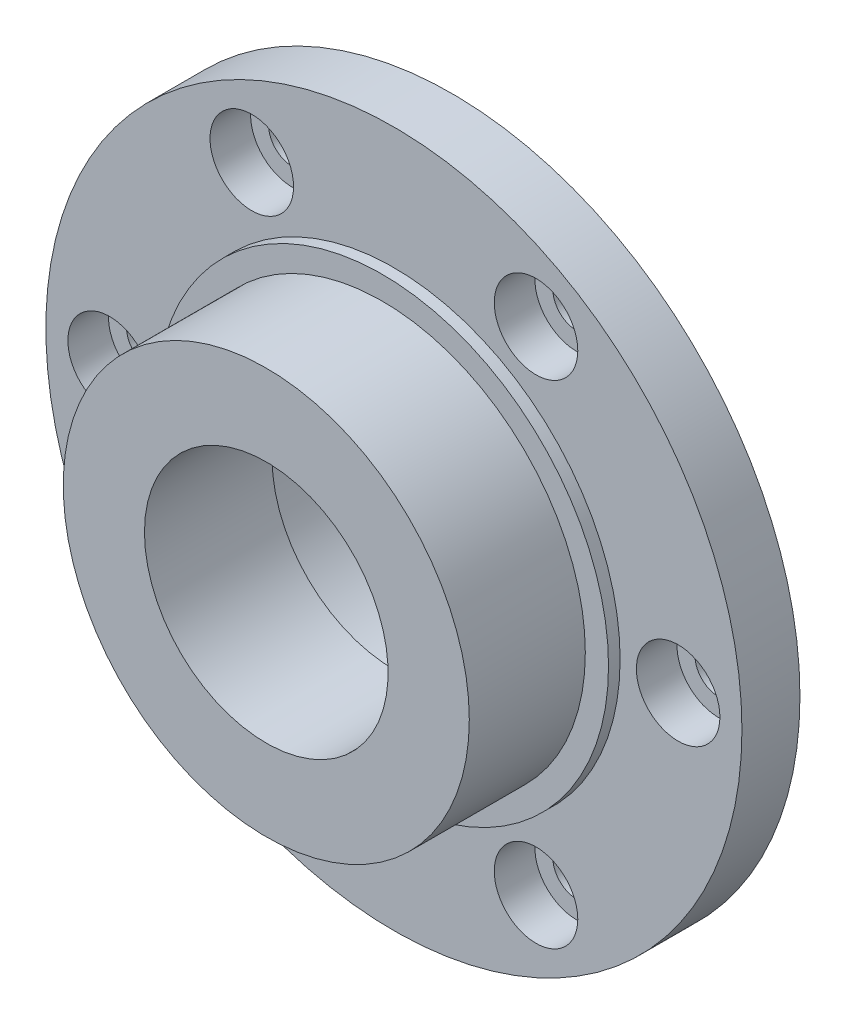
ISO-10303-21;
HEADER;
FILE_DESCRIPTION(('STEP AP214'),'2;1');
FILE_NAME('part.step','',(''),(''),'','','');
FILE_SCHEMA(('AUTOMOTIVE_DESIGN { 1 0 10303 214 1 1 1 1 }'));
ENDSEC;
DATA;
#1=APPLICATION_CONTEXT('core data for automotive mechanical design processes');
#2=APPLICATION_PROTOCOL_DEFINITION('international standard','automotive_design',2000,#1);
#3=PRODUCT_CONTEXT('',#1,'mechanical');
#4=PRODUCT('Part','Part','',(#3));
#5=PRODUCT_RELATED_PRODUCT_CATEGORY('part','',(#4));
#6=PRODUCT_DEFINITION_FORMATION('','',#4);
#7=PRODUCT_DEFINITION_CONTEXT('part definition',#1,'design');
#8=PRODUCT_DEFINITION('design','',#6,#7);
#9=PRODUCT_DEFINITION_SHAPE('','',#8);
#10=(LENGTH_UNIT() NAMED_UNIT(*) SI_UNIT(.MILLI.,.METRE.));
#11=(NAMED_UNIT(*) PLANE_ANGLE_UNIT() SI_UNIT($,.RADIAN.));
#12=(NAMED_UNIT(*) SI_UNIT($,.STERADIAN.) SOLID_ANGLE_UNIT());
#13=UNCERTAINTY_MEASURE_WITH_UNIT(LENGTH_MEASURE(1.E-05),#10,'distance_accuracy_value','');
#14=(GEOMETRIC_REPRESENTATION_CONTEXT(3) GLOBAL_UNCERTAINTY_ASSIGNED_CONTEXT((#13)) GLOBAL_UNIT_ASSIGNED_CONTEXT((#10,
#11,#12)) REPRESENTATION_CONTEXT('',''));
#15=CARTESIAN_POINT('',(0.,0.,0.));
#16=DIRECTION('',(0.,0.,1.));
#17=DIRECTION('',(1.,0.,0.));
#18=AXIS2_PLACEMENT_3D('',#15,#16,#17);
#19=CARTESIAN_POINT('',(12.25,-21.2176223927188,0.));
#20=DIRECTION('',(0.,0.,1.));
#21=DIRECTION('',(1.,0.,0.));
#22=AXIS2_PLACEMENT_3D('',#19,#20,#21);
#23=CYLINDRICAL_SURFACE('',#22,2.05);
#24=CARTESIAN_POINT('',(12.25,-21.2176223927188,0.));
#25=DIRECTION('',(0.,0.,1.));
#26=DIRECTION('',(1.,0.,0.));
#27=AXIS2_PLACEMENT_3D('',#24,#25,#26);
#28=CIRCLE('',#27,2.05);
#29=CARTESIAN_POINT('',(14.3,-21.2176223927188,0.));
#30=VERTEX_POINT('',#29);
#31=EDGE_CURVE('E108',#30,#30,#28,.T.);
#32=ORIENTED_EDGE('',*,*,#31,.F.);
#33=EDGE_LOOP('',(#32));
#34=FACE_BOUND('',#33,.T.);
#35=CARTESIAN_POINT('',(12.25,-21.2176223927188,1.5));
#36=DIRECTION('',(0.,0.,1.));
#37=DIRECTION('',(1.,0.,0.));
#38=AXIS2_PLACEMENT_3D('',#35,#36,#37);
#39=CIRCLE('',#38,2.05);
#40=CARTESIAN_POINT('',(14.3,-21.2176223927188,1.5));
#41=VERTEX_POINT('',#40);
#42=EDGE_CURVE('E41',#41,#41,#39,.F.);
#43=ORIENTED_EDGE('',*,*,#42,.F.);
#44=EDGE_LOOP('',(#43));
#45=FACE_BOUND('',#44,.T.);
#46=ADVANCED_FACE('F37',(#34,#45),#23,.F.);
#47=CARTESIAN_POINT('',(-12.2500000000001,-21.2176223927187,0.));
#48=DIRECTION('',(0.,0.,1.));
#49=DIRECTION('',(1.,0.,0.));
#50=AXIS2_PLACEMENT_3D('',#47,#48,#49);
#51=CYLINDRICAL_SURFACE('',#50,2.05);
#52=CARTESIAN_POINT('',(-12.2500000000001,-21.2176223927187,0.));
#53=DIRECTION('',(0.,0.,1.));
#54=DIRECTION('',(1.,0.,0.));
#55=AXIS2_PLACEMENT_3D('',#52,#53,#54);
#56=CIRCLE('',#55,2.05);
#57=CARTESIAN_POINT('',(-10.2000000000001,-21.2176223927187,0.));
#58=VERTEX_POINT('',#57);
#59=EDGE_CURVE('E112',#58,#58,#56,.T.);
#60=ORIENTED_EDGE('',*,*,#59,.F.);
#61=EDGE_LOOP('',(#60));
#62=FACE_BOUND('',#61,.T.);
#63=CARTESIAN_POINT('',(-12.2500000000001,-21.2176223927187,1.5));
#64=DIRECTION('',(0.,0.,1.));
#65=DIRECTION('',(1.,0.,0.));
#66=AXIS2_PLACEMENT_3D('',#63,#64,#65);
#67=CIRCLE('',#66,2.05);
#68=CARTESIAN_POINT('',(-10.2000000000001,-21.2176223927187,1.5));
#69=VERTEX_POINT('',#68);
#70=EDGE_CURVE('E85',#69,#69,#67,.F.);
#71=ORIENTED_EDGE('',*,*,#70,.F.);
#72=EDGE_LOOP('',(#71));
#73=FACE_BOUND('',#72,.T.);
#74=ADVANCED_FACE('F127',(#62,#73),#51,.F.);
#75=CARTESIAN_POINT('',(-24.5,1.71082585603314E-13,0.));
#76=DIRECTION('',(0.,0.,1.));
#77=DIRECTION('',(1.,0.,0.));
#78=AXIS2_PLACEMENT_3D('',#75,#76,#77);
#79=CYLINDRICAL_SURFACE('',#78,2.05);
#80=CARTESIAN_POINT('',(-24.5,1.71082585603314E-13,0.));
#81=DIRECTION('',(0.,0.,1.));
#82=DIRECTION('',(1.,0.,0.));
#83=AXIS2_PLACEMENT_3D('',#80,#81,#82);
#84=CIRCLE('',#83,2.05);
#85=CARTESIAN_POINT('',(-22.45,1.71082585603314E-13,0.));
#86=VERTEX_POINT('',#85);
#87=EDGE_CURVE('E103',#86,#86,#84,.T.);
#88=ORIENTED_EDGE('',*,*,#87,.F.);
#89=EDGE_LOOP('',(#88));
#90=FACE_BOUND('',#89,.T.);
#91=CARTESIAN_POINT('',(-24.5,1.71082585603314E-13,1.5));
#92=DIRECTION('',(0.,0.,1.));
#93=DIRECTION('',(1.,0.,0.));
#94=AXIS2_PLACEMENT_3D('',#91,#92,#93);
#95=CIRCLE('',#94,2.05);
#96=CARTESIAN_POINT('',(-22.45,1.71082585603314E-13,1.5));
#97=VERTEX_POINT('',#96);
#98=EDGE_CURVE('E82',#97,#97,#95,.F.);
#99=ORIENTED_EDGE('',*,*,#98,.F.);
#100=EDGE_LOOP('',(#99));
#101=FACE_BOUND('',#100,.T.);
#102=ADVANCED_FACE('F123',(#90,#101),#79,.F.);
#103=CARTESIAN_POINT('',(-12.2499999999998,21.2176223927189,0.));
#104=DIRECTION('',(0.,0.,1.));
#105=DIRECTION('',(1.,0.,0.));
#106=AXIS2_PLACEMENT_3D('',#103,#104,#105);
#107=CYLINDRICAL_SURFACE('',#106,2.05);
#108=CARTESIAN_POINT('',(-12.2499999999998,21.2176223927189,0.));
#109=DIRECTION('',(0.,0.,1.));
#110=DIRECTION('',(1.,0.,0.));
#111=AXIS2_PLACEMENT_3D('',#108,#109,#110);
#112=CIRCLE('',#111,2.05);
#113=CARTESIAN_POINT('',(-10.1999999999998,21.2176223927189,0.));
#114=VERTEX_POINT('',#113);
#115=EDGE_CURVE('E97',#114,#114,#112,.T.);
#116=ORIENTED_EDGE('',*,*,#115,.F.);
#117=EDGE_LOOP('',(#116));
#118=FACE_BOUND('',#117,.T.);
#119=CARTESIAN_POINT('',(-12.2499999999998,21.2176223927189,1.5));
#120=DIRECTION('',(0.,0.,1.));
#121=DIRECTION('',(1.,0.,0.));
#122=AXIS2_PLACEMENT_3D('',#119,#120,#121);
#123=CIRCLE('',#122,2.05);
#124=CARTESIAN_POINT('',(-10.1999999999998,21.2176223927189,1.5));
#125=VERTEX_POINT('',#124);
#126=EDGE_CURVE('E78',#125,#125,#123,.F.);
#127=ORIENTED_EDGE('',*,*,#126,.F.);
#128=EDGE_LOOP('',(#127));
#129=FACE_BOUND('',#128,.T.);
#130=ADVANCED_FACE('F126',(#118,#129),#107,.F.);
#131=CARTESIAN_POINT('',(12.2500000000002,21.2176223927186,0.));
#132=DIRECTION('',(0.,0.,1.));
#133=DIRECTION('',(1.,0.,0.));
#134=AXIS2_PLACEMENT_3D('',#131,#132,#133);
#135=CYLINDRICAL_SURFACE('',#134,2.05);
#136=CARTESIAN_POINT('',(12.2500000000002,21.2176223927186,0.));
#137=DIRECTION('',(0.,0.,1.));
#138=DIRECTION('',(1.,0.,0.));
#139=AXIS2_PLACEMENT_3D('',#136,#137,#138);
#140=CIRCLE('',#139,2.05);
#141=CARTESIAN_POINT('',(14.3000000000002,21.2176223927186,0.));
#142=VERTEX_POINT('',#141);
#143=EDGE_CURVE('E92',#142,#142,#140,.T.);
#144=ORIENTED_EDGE('',*,*,#143,.F.);
#145=EDGE_LOOP('',(#144));
#146=FACE_BOUND('',#145,.T.);
#147=CARTESIAN_POINT('',(12.2500000000002,21.2176223927186,1.5));
#148=DIRECTION('',(0.,0.,1.));
#149=DIRECTION('',(1.,0.,0.));
#150=AXIS2_PLACEMENT_3D('',#147,#148,#149);
#151=CIRCLE('',#150,2.05);
#152=CARTESIAN_POINT('',(14.3000000000002,21.2176223927186,1.5));
#153=VERTEX_POINT('',#152);
#154=EDGE_CURVE('E73',#153,#153,#151,.F.);
#155=ORIENTED_EDGE('',*,*,#154,.F.);
#156=EDGE_LOOP('',(#155));
#157=FACE_BOUND('',#156,.T.);
#158=ADVANCED_FACE('F160',(#146,#157),#135,.F.);
#159=CARTESIAN_POINT('',(24.5,0.,0.));
#160=DIRECTION('',(0.,0.,1.));
#161=DIRECTION('',(1.,0.,0.));
#162=AXIS2_PLACEMENT_3D('',#159,#160,#161);
#163=CYLINDRICAL_SURFACE('',#162,2.05);
#164=CARTESIAN_POINT('',(24.5,0.,0.));
#165=DIRECTION('',(0.,0.,1.));
#166=DIRECTION('',(1.,0.,0.));
#167=AXIS2_PLACEMENT_3D('',#164,#165,#166);
#168=CIRCLE('',#167,2.05);
#169=CARTESIAN_POINT('',(26.55,0.,0.));
#170=VERTEX_POINT('',#169);
#171=EDGE_CURVE('E106',#170,#170,#168,.T.);
#172=ORIENTED_EDGE('',*,*,#171,.F.);
#173=EDGE_LOOP('',(#172));
#174=FACE_BOUND('',#173,.T.);
#175=CARTESIAN_POINT('',(24.5,0.,1.5));
#176=DIRECTION('',(0.,0.,1.));
#177=DIRECTION('',(1.,0.,0.));
#178=AXIS2_PLACEMENT_3D('',#175,#176,#177);
#179=CIRCLE('',#178,2.05);
#180=CARTESIAN_POINT('',(26.55,0.,1.5));
#181=VERTEX_POINT('',#180);
#182=EDGE_CURVE('E69',#181,#181,#179,.F.);
#183=ORIENTED_EDGE('',*,*,#182,.F.);
#184=EDGE_LOOP('',(#183));
#185=FACE_BOUND('',#184,.T.);
#186=ADVANCED_FACE('F212',(#174,#185),#163,.F.);
#187=CARTESIAN_POINT('',(0.,0.,5.));
#188=DIRECTION('',(0.,0.,-1.));
#189=DIRECTION('',(-1.,0.,0.));
#190=AXIS2_PLACEMENT_3D('',#187,#188,#189);
#191=CYLINDRICAL_SURFACE('',#190,30.);
#192=CARTESIAN_POINT('',(0.,0.,5.));
#193=DIRECTION('',(0.,0.,1.));
#194=DIRECTION('',(1.,0.,0.));
#195=AXIS2_PLACEMENT_3D('',#192,#193,#194);
#196=CIRCLE('',#195,30.);
#197=CARTESIAN_POINT('',(30.,0.,5.));
#198=VERTEX_POINT('',#197);
#199=EDGE_CURVE('E52',#198,#198,#196,.T.);
#200=ORIENTED_EDGE('',*,*,#199,.F.);
#201=EDGE_LOOP('',(#200));
#202=FACE_BOUND('',#201,.T.);
#203=CARTESIAN_POINT('',(0.,0.,0.));
#204=DIRECTION('',(0.,0.,1.));
#205=DIRECTION('',(1.,0.,0.));
#206=AXIS2_PLACEMENT_3D('',#203,#204,#205);
#207=CIRCLE('',#206,30.);
#208=CARTESIAN_POINT('',(30.,0.,0.));
#209=VERTEX_POINT('',#208);
#210=EDGE_CURVE('E61',#209,#209,#207,.T.);
#211=ORIENTED_EDGE('',*,*,#210,.T.);
#212=EDGE_LOOP('',(#211));
#213=FACE_BOUND('',#212,.T.);
#214=ADVANCED_FACE('F39',(#202,#213),#191,.T.);
#215=CARTESIAN_POINT('',(0.,0.,5.));
#216=DIRECTION('',(0.,0.,1.));
#217=DIRECTION('',(1.,0.,0.));
#218=AXIS2_PLACEMENT_3D('',#215,#216,#217);
#219=PLANE('',#218);
#220=CARTESIAN_POINT('',(24.5,0.,5.));
#221=DIRECTION('',(0.,0.,1.));
#222=DIRECTION('',(1.,0.,0.));
#223=AXIS2_PLACEMENT_3D('',#220,#221,#222);
#224=CIRCLE('',#223,3.6);
#225=CARTESIAN_POINT('',(28.1,0.,5.));
#226=VERTEX_POINT('',#225);
#227=EDGE_CURVE('E296',#226,#226,#224,.T.);
#228=ORIENTED_EDGE('',*,*,#227,.F.);
#229=EDGE_LOOP('',(#228));
#230=FACE_BOUND('',#229,.T.);
#231=CARTESIAN_POINT('',(12.2500000000002,21.2176223927186,5.));
#232=DIRECTION('',(0.,0.,1.));
#233=DIRECTION('',(1.,0.,0.));
#234=AXIS2_PLACEMENT_3D('',#231,#232,#233);
#235=CIRCLE('',#234,3.6);
#236=CARTESIAN_POINT('',(15.8500000000002,21.2176223927186,5.));
#237=VERTEX_POINT('',#236);
#238=EDGE_CURVE('E288',#237,#237,#235,.T.);
#239=ORIENTED_EDGE('',*,*,#238,.F.);
#240=EDGE_LOOP('',(#239));
#241=FACE_BOUND('',#240,.T.);
#242=CARTESIAN_POINT('',(-12.2499999999998,21.2176223927189,5.));
#243=DIRECTION('',(0.,0.,1.));
#244=DIRECTION('',(1.,0.,0.));
#245=AXIS2_PLACEMENT_3D('',#242,#243,#244);
#246=CIRCLE('',#245,3.6);
#247=CARTESIAN_POINT('',(-8.6499999999998,21.2176223927189,5.));
#248=VERTEX_POINT('',#247);
#249=EDGE_CURVE('E280',#248,#248,#246,.T.);
#250=ORIENTED_EDGE('',*,*,#249,.F.);
#251=EDGE_LOOP('',(#250));
#252=FACE_BOUND('',#251,.T.);
#253=CARTESIAN_POINT('',(-24.5,1.71082585603314E-13,5.));
#254=DIRECTION('',(0.,0.,1.));
#255=DIRECTION('',(1.,0.,0.));
#256=AXIS2_PLACEMENT_3D('',#253,#254,#255);
#257=CIRCLE('',#256,3.6);
#258=CARTESIAN_POINT('',(-20.9,1.71082585603314E-13,5.));
#259=VERTEX_POINT('',#258);
#260=EDGE_CURVE('E271',#259,#259,#257,.T.);
#261=ORIENTED_EDGE('',*,*,#260,.F.);
#262=EDGE_LOOP('',(#261));
#263=FACE_BOUND('',#262,.T.);
#264=CARTESIAN_POINT('',(-12.2500000000001,-21.2176223927187,5.));
#265=DIRECTION('',(0.,0.,1.));
#266=DIRECTION('',(1.,0.,0.));
#267=AXIS2_PLACEMENT_3D('',#264,#265,#266);
#268=CIRCLE('',#267,3.6);
#269=CARTESIAN_POINT('',(-8.6500000000001,-21.2176223927187,5.));
#270=VERTEX_POINT('',#269);
#271=EDGE_CURVE('E262',#270,#270,#268,.T.);
#272=ORIENTED_EDGE('',*,*,#271,.F.);
#273=EDGE_LOOP('',(#272));
#274=FACE_BOUND('',#273,.T.);
#275=CARTESIAN_POINT('',(12.25,-21.2176223927188,5.));
#276=DIRECTION('',(0.,0.,1.));
#277=DIRECTION('',(1.,0.,0.));
#278=AXIS2_PLACEMENT_3D('',#275,#276,#277);
#279=CIRCLE('',#278,3.6);
#280=CARTESIAN_POINT('',(15.85,-21.2176223927188,5.));
#281=VERTEX_POINT('',#280);
#282=EDGE_CURVE('E269',#281,#281,#279,.T.);
#283=ORIENTED_EDGE('',*,*,#282,.F.);
#284=EDGE_LOOP('',(#283));
#285=FACE_BOUND('',#284,.T.);
#286=CARTESIAN_POINT('',(0.,0.,5.));
#287=DIRECTION('',(0.,0.,1.));
#288=DIRECTION('',(1.,0.,0.));
#289=AXIS2_PLACEMENT_3D('',#286,#287,#288);
#290=CIRCLE('',#289,19.5);
#291=CARTESIAN_POINT('',(19.5,0.,5.));
#292=VERTEX_POINT('',#291);
#293=EDGE_CURVE('E46',#292,#292,#290,.T.);
#294=ORIENTED_EDGE('',*,*,#293,.F.);
#295=EDGE_LOOP('',(#294));
#296=FACE_BOUND('',#295,.T.);
#297=ORIENTED_EDGE('',*,*,#199,.T.);
#298=EDGE_LOOP('',(#297));
#299=FACE_BOUND('',#298,.T.);
#300=ADVANCED_FACE('F183',(#230,#241,#252,#263,#274,#285,#296,#299),#219,.T.);
#301=CARTESIAN_POINT('',(0.,0.,0.));
#302=DIRECTION('',(0.,0.,1.));
#303=DIRECTION('',(1.,0.,0.));
#304=AXIS2_PLACEMENT_3D('',#301,#302,#303);
#305=PLANE('',#304);
#306=CARTESIAN_POINT('',(0.,0.,0.));
#307=DIRECTION('',(0.,0.,-1.));
#308=DIRECTION('',(-1.,0.,0.));
#309=AXIS2_PLACEMENT_3D('',#306,#307,#308);
#310=CIRCLE('',#309,12.025);
#311=CARTESIAN_POINT('',(-12.025,0.,0.));
#312=VERTEX_POINT('',#311);
#313=EDGE_CURVE('E193',#312,#312,#310,.T.);
#314=ORIENTED_EDGE('',*,*,#313,.F.);
#315=EDGE_LOOP('',(#314));
#316=FACE_BOUND('',#315,.T.);
#317=ORIENTED_EDGE('',*,*,#171,.T.);
#318=EDGE_LOOP('',(#317));
#319=FACE_BOUND('',#318,.T.);
#320=ORIENTED_EDGE('',*,*,#143,.T.);
#321=EDGE_LOOP('',(#320));
#322=FACE_BOUND('',#321,.T.);
#323=ORIENTED_EDGE('',*,*,#115,.T.);
#324=EDGE_LOOP('',(#323));
#325=FACE_BOUND('',#324,.T.);
#326=ORIENTED_EDGE('',*,*,#87,.T.);
#327=EDGE_LOOP('',(#326));
#328=FACE_BOUND('',#327,.T.);
#329=ORIENTED_EDGE('',*,*,#59,.T.);
#330=EDGE_LOOP('',(#329));
#331=FACE_BOUND('',#330,.T.);
#332=ORIENTED_EDGE('',*,*,#31,.T.);
#333=EDGE_LOOP('',(#332));
#334=FACE_BOUND('',#333,.T.);
#335=ORIENTED_EDGE('',*,*,#210,.F.);
#336=EDGE_LOOP('',(#335));
#337=FACE_BOUND('',#336,.T.);
#338=ADVANCED_FACE('F120',(#316,#319,#322,#325,#328,#331,#334,#337),#305,.F.);
#339=CARTESIAN_POINT('',(0.,0.,6.));
#340=DIRECTION('',(0.,0.,-1.));
#341=DIRECTION('',(-1.,0.,0.));
#342=AXIS2_PLACEMENT_3D('',#339,#340,#341);
#343=CYLINDRICAL_SURFACE('',#342,19.5);
#344=CARTESIAN_POINT('',(0.,0.,6.));
#345=DIRECTION('',(0.,0.,1.));
#346=DIRECTION('',(1.,0.,0.));
#347=AXIS2_PLACEMENT_3D('',#344,#345,#346);
#348=CIRCLE('',#347,19.5);
#349=CARTESIAN_POINT('',(19.5,0.,6.));
#350=VERTEX_POINT('',#349);
#351=EDGE_CURVE('E58',#350,#350,#348,.T.);
#352=ORIENTED_EDGE('',*,*,#351,.F.);
#353=EDGE_LOOP('',(#352));
#354=FACE_BOUND('',#353,.T.);
#355=ORIENTED_EDGE('',*,*,#293,.T.);
#356=EDGE_LOOP('',(#355));
#357=FACE_BOUND('',#356,.T.);
#358=ADVANCED_FACE('F178',(#354,#357),#343,.T.);
#359=CARTESIAN_POINT('',(0.,0.,6.));
#360=DIRECTION('',(0.,0.,1.));
#361=DIRECTION('',(1.,0.,0.));
#362=AXIS2_PLACEMENT_3D('',#359,#360,#361);
#363=PLANE('',#362);
#364=CARTESIAN_POINT('',(0.,0.,6.));
#365=DIRECTION('',(0.,0.,1.));
#366=DIRECTION('',(1.,0.,0.));
#367=AXIS2_PLACEMENT_3D('',#364,#365,#366);
#368=CIRCLE('',#367,17.5);
#369=CARTESIAN_POINT('',(17.5,0.,6.));
#370=VERTEX_POINT('',#369);
#371=EDGE_CURVE('E10',#370,#370,#368,.T.);
#372=ORIENTED_EDGE('',*,*,#371,.F.);
#373=EDGE_LOOP('',(#372));
#374=FACE_BOUND('',#373,.T.);
#375=ORIENTED_EDGE('',*,*,#351,.T.);
#376=EDGE_LOOP('',(#375));
#377=FACE_BOUND('',#376,.T.);
#378=ADVANCED_FACE('F174',(#374,#377),#363,.T.);
#379=CARTESIAN_POINT('',(0.,0.,16.));
#380=DIRECTION('',(0.,0.,-1.));
#381=DIRECTION('',(-1.,0.,0.));
#382=AXIS2_PLACEMENT_3D('',#379,#380,#381);
#383=CYLINDRICAL_SURFACE('',#382,17.5);
#384=CARTESIAN_POINT('',(0.,0.,16.));
#385=DIRECTION('',(0.,0.,1.));
#386=DIRECTION('',(1.,0.,0.));
#387=AXIS2_PLACEMENT_3D('',#384,#385,#386);
#388=CIRCLE('',#387,17.5);
#389=CARTESIAN_POINT('',(17.5,0.,16.));
#390=VERTEX_POINT('',#389);
#391=EDGE_CURVE('E56',#390,#390,#388,.T.);
#392=ORIENTED_EDGE('',*,*,#391,.F.);
#393=EDGE_LOOP('',(#392));
#394=FACE_BOUND('',#393,.T.);
#395=ORIENTED_EDGE('',*,*,#371,.T.);
#396=EDGE_LOOP('',(#395));
#397=FACE_BOUND('',#396,.T.);
#398=ADVANCED_FACE('F170',(#394,#397),#383,.T.);
#399=CARTESIAN_POINT('',(0.,0.,16.));
#400=DIRECTION('',(0.,0.,1.));
#401=DIRECTION('',(1.,0.,0.));
#402=AXIS2_PLACEMENT_3D('',#399,#400,#401);
#403=PLANE('',#402);
#404=CARTESIAN_POINT('',(0.,0.,16.));
#405=DIRECTION('',(0.,0.,-1.));
#406=DIRECTION('',(-1.,0.,0.));
#407=AXIS2_PLACEMENT_3D('',#404,#405,#406);
#408=CIRCLE('',#407,10.5);
#409=CARTESIAN_POINT('',(-10.5,0.,16.));
#410=VERTEX_POINT('',#409);
#411=EDGE_CURVE('E322',#410,#410,#408,.T.);
#412=ORIENTED_EDGE('',*,*,#411,.T.);
#413=EDGE_LOOP('',(#412));
#414=FACE_BOUND('',#413,.T.);
#415=ORIENTED_EDGE('',*,*,#391,.T.);
#416=EDGE_LOOP('',(#415));
#417=FACE_BOUND('',#416,.T.);
#418=ADVANCED_FACE('F166',(#414,#417),#403,.T.);
#419=CARTESIAN_POINT('',(24.5,0.,1.5));
#420=DIRECTION('',(0.,0.,1.));
#421=DIRECTION('',(1.,0.,0.));
#422=AXIS2_PLACEMENT_3D('',#419,#420,#421);
#423=PLANE('',#422);
#424=CARTESIAN_POINT('',(24.5,0.,1.5));
#425=DIRECTION('',(0.,0.,1.));
#426=DIRECTION('',(1.,0.,0.));
#427=AXIS2_PLACEMENT_3D('',#424,#425,#426);
#428=CIRCLE('',#427,3.6);
#429=CARTESIAN_POINT('',(28.1,0.,1.5));
#430=VERTEX_POINT('',#429);
#431=EDGE_CURVE('E74',#430,#430,#428,.T.);
#432=ORIENTED_EDGE('',*,*,#431,.T.);
#433=EDGE_LOOP('',(#432));
#434=FACE_BOUND('',#433,.T.);
#435=ORIENTED_EDGE('',*,*,#182,.T.);
#436=EDGE_LOOP('',(#435));
#437=FACE_BOUND('',#436,.T.);
#438=ADVANCED_FACE('F169',(#434,#437),#423,.T.);
#439=CARTESIAN_POINT('',(24.5,0.,1.5));
#440=DIRECTION('',(0.,0.,1.));
#441=DIRECTION('',(1.,0.,0.));
#442=AXIS2_PLACEMENT_3D('',#439,#440,#441);
#443=CYLINDRICAL_SURFACE('',#442,3.6);
#444=ORIENTED_EDGE('',*,*,#431,.F.);
#445=EDGE_LOOP('',(#444));
#446=FACE_BOUND('',#445,.T.);
#447=ORIENTED_EDGE('',*,*,#227,.T.);
#448=EDGE_LOOP('',(#447));
#449=FACE_BOUND('',#448,.T.);
#450=ADVANCED_FACE('F225',(#446,#449),#443,.F.);
#451=CARTESIAN_POINT('',(12.2500000000002,21.2176223927186,1.5));
#452=DIRECTION('',(0.,0.,1.));
#453=DIRECTION('',(1.,0.,0.));
#454=AXIS2_PLACEMENT_3D('',#451,#452,#453);
#455=PLANE('',#454);
#456=CARTESIAN_POINT('',(12.2500000000002,21.2176223927186,1.5));
#457=DIRECTION('',(0.,0.,1.));
#458=DIRECTION('',(1.,0.,0.));
#459=AXIS2_PLACEMENT_3D('',#456,#457,#458);
#460=CIRCLE('',#459,3.6);
#461=CARTESIAN_POINT('',(15.8500000000002,21.2176223927186,1.5));
#462=VERTEX_POINT('',#461);
#463=EDGE_CURVE('E283',#462,#462,#460,.T.);
#464=ORIENTED_EDGE('',*,*,#463,.T.);
#465=EDGE_LOOP('',(#464));
#466=FACE_BOUND('',#465,.T.);
#467=ORIENTED_EDGE('',*,*,#154,.T.);
#468=EDGE_LOOP('',(#467));
#469=FACE_BOUND('',#468,.T.);
#470=ADVANCED_FACE('F208',(#466,#469),#455,.T.);
#471=CARTESIAN_POINT('',(12.2500000000002,21.2176223927186,1.5));
#472=DIRECTION('',(0.,0.,1.));
#473=DIRECTION('',(1.,0.,0.));
#474=AXIS2_PLACEMENT_3D('',#471,#472,#473);
#475=CYLINDRICAL_SURFACE('',#474,3.6);
#476=ORIENTED_EDGE('',*,*,#463,.F.);
#477=EDGE_LOOP('',(#476));
#478=FACE_BOUND('',#477,.T.);
#479=ORIENTED_EDGE('',*,*,#238,.T.);
#480=EDGE_LOOP('',(#479));
#481=FACE_BOUND('',#480,.T.);
#482=ADVANCED_FACE('F202',(#478,#481),#475,.F.);
#483=CARTESIAN_POINT('',(-12.2499999999998,21.2176223927189,1.5));
#484=DIRECTION('',(0.,0.,1.));
#485=DIRECTION('',(1.,0.,0.));
#486=AXIS2_PLACEMENT_3D('',#483,#484,#485);
#487=PLANE('',#486);
#488=CARTESIAN_POINT('',(-12.2499999999998,21.2176223927189,1.5));
#489=DIRECTION('',(0.,0.,1.));
#490=DIRECTION('',(1.,0.,0.));
#491=AXIS2_PLACEMENT_3D('',#488,#489,#490);
#492=CIRCLE('',#491,3.6);
#493=CARTESIAN_POINT('',(-8.6499999999998,21.2176223927189,1.5));
#494=VERTEX_POINT('',#493);
#495=EDGE_CURVE('E278',#494,#494,#492,.T.);
#496=ORIENTED_EDGE('',*,*,#495,.T.);
#497=EDGE_LOOP('',(#496));
#498=FACE_BOUND('',#497,.T.);
#499=ORIENTED_EDGE('',*,*,#126,.T.);
#500=EDGE_LOOP('',(#499));
#501=FACE_BOUND('',#500,.T.);
#502=ADVANCED_FACE('F144',(#498,#501),#487,.T.);
#503=CARTESIAN_POINT('',(-12.2499999999998,21.2176223927189,1.5));
#504=DIRECTION('',(0.,0.,1.));
#505=DIRECTION('',(1.,0.,0.));
#506=AXIS2_PLACEMENT_3D('',#503,#504,#505);
#507=CYLINDRICAL_SURFACE('',#506,3.6);
#508=ORIENTED_EDGE('',*,*,#495,.F.);
#509=EDGE_LOOP('',(#508));
#510=FACE_BOUND('',#509,.T.);
#511=ORIENTED_EDGE('',*,*,#249,.T.);
#512=EDGE_LOOP('',(#511));
#513=FACE_BOUND('',#512,.T.);
#514=ADVANCED_FACE('F134',(#510,#513),#507,.F.);
#515=CARTESIAN_POINT('',(-24.5,1.71082585603314E-13,1.5));
#516=DIRECTION('',(0.,0.,1.));
#517=DIRECTION('',(1.,0.,0.));
#518=AXIS2_PLACEMENT_3D('',#515,#516,#517);
#519=PLANE('',#518);
#520=CARTESIAN_POINT('',(-24.5,1.71082585603314E-13,1.5));
#521=DIRECTION('',(0.,0.,1.));
#522=DIRECTION('',(1.,0.,0.));
#523=AXIS2_PLACEMENT_3D('',#520,#521,#522);
#524=CIRCLE('',#523,3.6);
#525=CARTESIAN_POINT('',(-20.9,1.71082585603314E-13,1.5));
#526=VERTEX_POINT('',#525);
#527=EDGE_CURVE('E265',#526,#526,#524,.T.);
#528=ORIENTED_EDGE('',*,*,#527,.T.);
#529=EDGE_LOOP('',(#528));
#530=FACE_BOUND('',#529,.T.);
#531=ORIENTED_EDGE('',*,*,#98,.T.);
#532=EDGE_LOOP('',(#531));
#533=FACE_BOUND('',#532,.T.);
#534=ADVANCED_FACE('F131',(#530,#533),#519,.T.);
#535=CARTESIAN_POINT('',(-24.5,1.71082585603314E-13,1.5));
#536=DIRECTION('',(0.,0.,1.));
#537=DIRECTION('',(1.,0.,0.));
#538=AXIS2_PLACEMENT_3D('',#535,#536,#537);
#539=CYLINDRICAL_SURFACE('',#538,3.6);
#540=ORIENTED_EDGE('',*,*,#527,.F.);
#541=EDGE_LOOP('',(#540));
#542=FACE_BOUND('',#541,.T.);
#543=ORIENTED_EDGE('',*,*,#260,.T.);
#544=EDGE_LOOP('',(#543));
#545=FACE_BOUND('',#544,.T.);
#546=ADVANCED_FACE('F133',(#542,#545),#539,.F.);
#547=CARTESIAN_POINT('',(-12.2500000000001,-21.2176223927187,1.5));
#548=DIRECTION('',(0.,0.,1.));
#549=DIRECTION('',(1.,0.,0.));
#550=AXIS2_PLACEMENT_3D('',#547,#548,#549);
#551=PLANE('',#550);
#552=CARTESIAN_POINT('',(-12.2500000000001,-21.2176223927187,1.5));
#553=DIRECTION('',(0.,0.,1.));
#554=DIRECTION('',(1.,0.,0.));
#555=AXIS2_PLACEMENT_3D('',#552,#553,#554);
#556=CIRCLE('',#555,3.6);
#557=CARTESIAN_POINT('',(-8.6500000000001,-21.2176223927187,1.5));
#558=VERTEX_POINT('',#557);
#559=EDGE_CURVE('E259',#558,#558,#556,.T.);
#560=ORIENTED_EDGE('',*,*,#559,.T.);
#561=EDGE_LOOP('',(#560));
#562=FACE_BOUND('',#561,.T.);
#563=ORIENTED_EDGE('',*,*,#70,.T.);
#564=EDGE_LOOP('',(#563));
#565=FACE_BOUND('',#564,.T.);
#566=ADVANCED_FACE('F141',(#562,#565),#551,.T.);
#567=CARTESIAN_POINT('',(-12.2500000000001,-21.2176223927187,1.5));
#568=DIRECTION('',(0.,0.,1.));
#569=DIRECTION('',(1.,0.,0.));
#570=AXIS2_PLACEMENT_3D('',#567,#568,#569);
#571=CYLINDRICAL_SURFACE('',#570,3.6);
#572=ORIENTED_EDGE('',*,*,#559,.F.);
#573=EDGE_LOOP('',(#572));
#574=FACE_BOUND('',#573,.T.);
#575=ORIENTED_EDGE('',*,*,#271,.T.);
#576=EDGE_LOOP('',(#575));
#577=FACE_BOUND('',#576,.T.);
#578=ADVANCED_FACE('F245',(#574,#577),#571,.F.);
#579=CARTESIAN_POINT('',(12.25,-21.2176223927188,1.5));
#580=DIRECTION('',(0.,0.,1.));
#581=DIRECTION('',(1.,0.,0.));
#582=AXIS2_PLACEMENT_3D('',#579,#580,#581);
#583=PLANE('',#582);
#584=CARTESIAN_POINT('',(12.25,-21.2176223927188,1.5));
#585=DIRECTION('',(0.,0.,1.));
#586=DIRECTION('',(1.,0.,0.));
#587=AXIS2_PLACEMENT_3D('',#584,#585,#586);
#588=CIRCLE('',#587,3.6);
#589=CARTESIAN_POINT('',(15.85,-21.2176223927188,1.5));
#590=VERTEX_POINT('',#589);
#591=EDGE_CURVE('E299',#590,#590,#588,.T.);
#592=ORIENTED_EDGE('',*,*,#591,.T.);
#593=EDGE_LOOP('',(#592));
#594=FACE_BOUND('',#593,.T.);
#595=ORIENTED_EDGE('',*,*,#42,.T.);
#596=EDGE_LOOP('',(#595));
#597=FACE_BOUND('',#596,.T.);
#598=ADVANCED_FACE('F241',(#594,#597),#583,.T.);
#599=CARTESIAN_POINT('',(12.25,-21.2176223927188,1.5));
#600=DIRECTION('',(0.,0.,1.));
#601=DIRECTION('',(1.,0.,0.));
#602=AXIS2_PLACEMENT_3D('',#599,#600,#601);
#603=CYLINDRICAL_SURFACE('',#602,3.6);
#604=ORIENTED_EDGE('',*,*,#591,.F.);
#605=EDGE_LOOP('',(#604));
#606=FACE_BOUND('',#605,.T.);
#607=ORIENTED_EDGE('',*,*,#282,.T.);
#608=EDGE_LOOP('',(#607));
#609=FACE_BOUND('',#608,.T.);
#610=ADVANCED_FACE('F244',(#606,#609),#603,.F.);
#611=CARTESIAN_POINT('',(0.,0.,5.));
#612=DIRECTION('',(0.,0.,-1.));
#613=DIRECTION('',(-1.,0.,0.));
#614=AXIS2_PLACEMENT_3D('',#611,#612,#613);
#615=CYLINDRICAL_SURFACE('',#614,12.025);
#616=CARTESIAN_POINT('',(0.,0.,5.));
#617=DIRECTION('',(0.,0.,-1.));
#618=DIRECTION('',(-1.,0.,0.));
#619=AXIS2_PLACEMENT_3D('',#616,#617,#618);
#620=CIRCLE('',#619,12.025);
#621=CARTESIAN_POINT('',(-12.025,0.,5.));
#622=VERTEX_POINT('',#621);
#623=EDGE_CURVE('E293',#622,#622,#620,.T.);
#624=ORIENTED_EDGE('',*,*,#623,.F.);
#625=EDGE_LOOP('',(#624));
#626=FACE_BOUND('',#625,.T.);
#627=ORIENTED_EDGE('',*,*,#313,.T.);
#628=EDGE_LOOP('',(#627));
#629=FACE_BOUND('',#628,.T.);
#630=ADVANCED_FACE('F235',(#626,#629),#615,.F.);
#631=CARTESIAN_POINT('',(0.,0.,5.));
#632=DIRECTION('',(0.,0.,-1.));
#633=DIRECTION('',(-1.,0.,0.));
#634=AXIS2_PLACEMENT_3D('',#631,#632,#633);
#635=PLANE('',#634);
#636=CARTESIAN_POINT('',(0.,0.,5.));
#637=DIRECTION('',(0.,0.,-1.));
#638=DIRECTION('',(-1.,0.,0.));
#639=AXIS2_PLACEMENT_3D('',#636,#637,#638);
#640=CIRCLE('',#639,10.5);
#641=CARTESIAN_POINT('',(-10.5,0.,5.));
#642=VERTEX_POINT('',#641);
#643=EDGE_CURVE('E326',#642,#642,#640,.T.);
#644=ORIENTED_EDGE('',*,*,#643,.F.);
#645=EDGE_LOOP('',(#644));
#646=FACE_BOUND('',#645,.T.);
#647=ORIENTED_EDGE('',*,*,#623,.T.);
#648=EDGE_LOOP('',(#647));
#649=FACE_BOUND('',#648,.T.);
#650=ADVANCED_FACE('F338',(#646,#649),#635,.T.);
#651=CARTESIAN_POINT('',(0.,0.,16.));
#652=DIRECTION('',(0.,0.,-1.));
#653=DIRECTION('',(-1.,0.,0.));
#654=AXIS2_PLACEMENT_3D('',#651,#652,#653);
#655=CYLINDRICAL_SURFACE('',#654,10.5);
#656=ORIENTED_EDGE('',*,*,#411,.F.);
#657=EDGE_LOOP('',(#656));
#658=FACE_BOUND('',#657,.T.);
#659=ORIENTED_EDGE('',*,*,#643,.T.);
#660=EDGE_LOOP('',(#659));
#661=FACE_BOUND('',#660,.T.);
#662=ADVANCED_FACE('F335',(#658,#661),#655,.F.);
#663=CLOSED_SHELL('',(#46,#74,#102,#130,#158,#186,#214,#300,#338,#358,#378,#398,#418,#438,#450,
#470,#482,#502,#514,#534,#546,#566,#578,#598,#610,#630,#650,#662));
#664=MANIFOLD_SOLID_BREP('B2',#663);
#665=ADVANCED_BREP_SHAPE_REPRESENTATION('',(#18,#664),#14);
#666=SHAPE_DEFINITION_REPRESENTATION(#9,#665);
ENDSEC;
END-ISO-10303-21;
